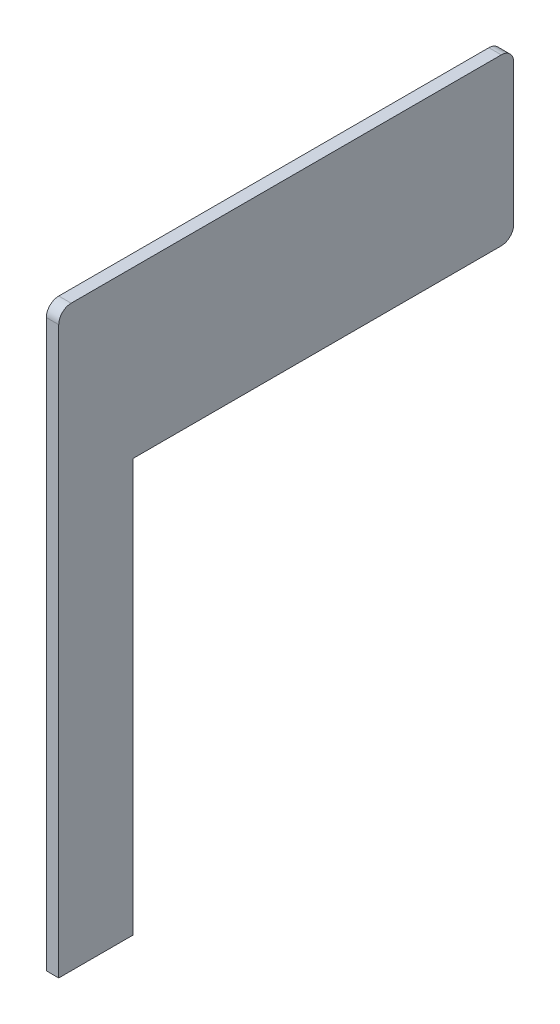
ISO-10303-21;
HEADER;
FILE_DESCRIPTION(('STEP AP214'),'2;1');
FILE_NAME('part.step','',(''),(''),'','','');
FILE_SCHEMA(('AUTOMOTIVE_DESIGN { 1 0 10303 214 1 1 1 1 }'));
ENDSEC;
DATA;
#1=APPLICATION_CONTEXT('core data for automotive mechanical design processes');
#2=APPLICATION_PROTOCOL_DEFINITION('international standard','automotive_design',2000,#1);
#3=PRODUCT_CONTEXT('',#1,'mechanical');
#4=PRODUCT('Part','Part','',(#3));
#5=PRODUCT_RELATED_PRODUCT_CATEGORY('part','',(#4));
#6=PRODUCT_DEFINITION_FORMATION('','',#4);
#7=PRODUCT_DEFINITION_CONTEXT('part definition',#1,'design');
#8=PRODUCT_DEFINITION('design','',#6,#7);
#9=PRODUCT_DEFINITION_SHAPE('','',#8);
#10=(LENGTH_UNIT() NAMED_UNIT(*) SI_UNIT(.MILLI.,.METRE.));
#11=(NAMED_UNIT(*) PLANE_ANGLE_UNIT() SI_UNIT($,.RADIAN.));
#12=(NAMED_UNIT(*) SI_UNIT($,.STERADIAN.) SOLID_ANGLE_UNIT());
#13=UNCERTAINTY_MEASURE_WITH_UNIT(LENGTH_MEASURE(1.E-05),#10,'distance_accuracy_value','');
#14=(GEOMETRIC_REPRESENTATION_CONTEXT(3) GLOBAL_UNCERTAINTY_ASSIGNED_CONTEXT((#13)) GLOBAL_UNIT_ASSIGNED_CONTEXT((#10,
#11,#12)) REPRESENTATION_CONTEXT('',''));
#15=CARTESIAN_POINT('',(0.,0.,0.));
#16=DIRECTION('',(0.,0.,1.));
#17=DIRECTION('',(1.,0.,0.));
#18=AXIS2_PLACEMENT_3D('',#15,#16,#17);
#19=CARTESIAN_POINT('',(0.3,2.,5.5));
#20=DIRECTION('',(0.,-1.,0.));
#21=DIRECTION('',(0.,0.,-1.));
#22=AXIS2_PLACEMENT_3D('',#19,#20,#21);
#23=PLANE('',#22);
#24=DIRECTION('',(0.,0.,1.));
#25=VECTOR('',#24,1.);
#26=CARTESIAN_POINT('',(0.3,2.,5.5));
#27=LINE('',#26,#25);
#28=CARTESIAN_POINT('',(0.3,2.,-5.2));
#29=VERTEX_POINT('',#28);
#30=CARTESIAN_POINT('',(0.3,2.,5.2));
#31=VERTEX_POINT('',#30);
#32=EDGE_CURVE('E149',#29,#31,#27,.T.);
#33=ORIENTED_EDGE('',*,*,#32,.F.);
#34=DIRECTION('',(-1.,0.,0.));
#35=VECTOR('',#34,1.);
#36=CARTESIAN_POINT('',(0.3,2.,-5.2));
#37=LINE('',#36,#35);
#38=CARTESIAN_POINT('',(0.,2.,-5.2));
#39=VERTEX_POINT('',#38);
#40=EDGE_CURVE('E49',#29,#39,#37,.T.);
#41=ORIENTED_EDGE('',*,*,#40,.T.);
#42=DIRECTION('',(0.,0.,1.));
#43=VECTOR('',#42,1.);
#44=CARTESIAN_POINT('',(0.,2.,5.5));
#45=LINE('',#44,#43);
#46=CARTESIAN_POINT('',(0.,2.,5.2));
#47=VERTEX_POINT('',#46);
#48=EDGE_CURVE('E145',#39,#47,#45,.T.);
#49=ORIENTED_EDGE('',*,*,#48,.T.);
#50=DIRECTION('',(-1.,0.,0.));
#51=VECTOR('',#50,1.);
#52=CARTESIAN_POINT('',(0.3,2.,5.2));
#53=LINE('',#52,#51);
#54=EDGE_CURVE('E64',#47,#31,#53,.F.);
#55=ORIENTED_EDGE('',*,*,#54,.T.);
#56=EDGE_LOOP('',(#33,#41,#49,#55));
#57=FACE_BOUND('',#56,.T.);
#58=ADVANCED_FACE('F41',(#57),#23,.F.);
#59=CARTESIAN_POINT('',(0.3,-2.,5.5));
#60=DIRECTION('',(0.,0.,-1.));
#61=DIRECTION('',(0.,1.,0.));
#62=AXIS2_PLACEMENT_3D('',#59,#60,#61);
#63=PLANE('',#62);
#64=DIRECTION('',(0.,-1.,0.));
#65=VECTOR('',#64,1.);
#66=CARTESIAN_POINT('',(0.3,1.5,5.5));
#67=LINE('',#66,#65);
#68=CARTESIAN_POINT('',(0.3,1.7,5.5));
#69=VERTEX_POINT('',#68);
#70=CARTESIAN_POINT('',(0.3,-11.98,5.5));
#71=VERTEX_POINT('',#70);
#72=EDGE_CURVE('E152',#69,#71,#67,.T.);
#73=ORIENTED_EDGE('',*,*,#72,.F.);
#74=DIRECTION('',(-1.,0.,0.));
#75=VECTOR('',#74,1.);
#76=CARTESIAN_POINT('',(0.3,1.7,5.5));
#77=LINE('',#76,#75);
#78=CARTESIAN_POINT('',(0.,1.7,5.5));
#79=VERTEX_POINT('',#78);
#80=EDGE_CURVE('E11',#69,#79,#77,.T.);
#81=ORIENTED_EDGE('',*,*,#80,.T.);
#82=DIRECTION('',(0.,-1.,0.));
#83=VECTOR('',#82,1.);
#84=CARTESIAN_POINT('',(0.,-2.,5.5));
#85=LINE('',#84,#83);
#86=CARTESIAN_POINT('',(0.,-11.98,5.5));
#87=VERTEX_POINT('',#86);
#88=EDGE_CURVE('E126',#79,#87,#85,.T.);
#89=ORIENTED_EDGE('',*,*,#88,.T.);
#90=DIRECTION('',(-1.,0.,0.));
#91=VECTOR('',#90,1.);
#92=CARTESIAN_POINT('',(0.,-11.98,5.5));
#93=LINE('',#92,#91);
#94=EDGE_CURVE('E140',#71,#87,#93,.T.);
#95=ORIENTED_EDGE('',*,*,#94,.F.);
#96=EDGE_LOOP('',(#73,#81,#89,#95));
#97=FACE_BOUND('',#96,.T.);
#98=ADVANCED_FACE('F191',(#97),#63,.F.);
#99=CARTESIAN_POINT('',(0.3,-8.98,3.7));
#100=DIRECTION('',(0.,0.,1.));
#101=DIRECTION('',(1.,0.,0.));
#102=AXIS2_PLACEMENT_3D('',#99,#100,#101);
#103=PLANE('',#102);
#104=DIRECTION('',(0.,1.,0.));
#105=VECTOR('',#104,1.);
#106=CARTESIAN_POINT('',(0.,-8.98,3.7));
#107=LINE('',#106,#105);
#108=CARTESIAN_POINT('',(0.,-11.98,3.7));
#109=VERTEX_POINT('',#108);
#110=CARTESIAN_POINT('',(0.,-2.,3.7));
#111=VERTEX_POINT('',#110);
#112=EDGE_CURVE('E114',#109,#111,#107,.T.);
#113=ORIENTED_EDGE('',*,*,#112,.T.);
#114=DIRECTION('',(-1.,0.,0.));
#115=VECTOR('',#114,1.);
#116=CARTESIAN_POINT('',(0.3,-2.,3.7));
#117=LINE('',#116,#115);
#118=CARTESIAN_POINT('',(0.3,-2.,3.7));
#119=VERTEX_POINT('',#118);
#120=EDGE_CURVE('E158',#119,#111,#117,.T.);
#121=ORIENTED_EDGE('',*,*,#120,.F.);
#122=DIRECTION('',(0.,1.,0.));
#123=VECTOR('',#122,1.);
#124=CARTESIAN_POINT('',(0.3,-8.98,3.7));
#125=LINE('',#124,#123);
#126=CARTESIAN_POINT('',(0.3,-11.98,3.7));
#127=VERTEX_POINT('',#126);
#128=EDGE_CURVE('E131',#127,#119,#125,.T.);
#129=ORIENTED_EDGE('',*,*,#128,.F.);
#130=DIRECTION('',(1.,0.,0.));
#131=VECTOR('',#130,1.);
#132=CARTESIAN_POINT('',(0.,-11.98,3.7));
#133=LINE('',#132,#131);
#134=EDGE_CURVE('E129',#109,#127,#133,.T.);
#135=ORIENTED_EDGE('',*,*,#134,.F.);
#136=EDGE_LOOP('',(#113,#121,#129,#135));
#137=FACE_BOUND('',#136,.T.);
#138=ADVANCED_FACE('F130',(#137),#103,.F.);
#139=CARTESIAN_POINT('',(0.3,-2.,3.7));
#140=DIRECTION('',(0.,1.,0.));
#141=DIRECTION('',(0.,0.,1.));
#142=AXIS2_PLACEMENT_3D('',#139,#140,#141);
#143=PLANE('',#142);
#144=DIRECTION('',(0.,0.,-1.));
#145=VECTOR('',#144,1.);
#146=CARTESIAN_POINT('',(0.,-2.,3.7));
#147=LINE('',#146,#145);
#148=CARTESIAN_POINT('',(0.,-2.,-5.2));
#149=VERTEX_POINT('',#148);
#150=EDGE_CURVE('E122',#111,#149,#147,.T.);
#151=ORIENTED_EDGE('',*,*,#150,.T.);
#152=DIRECTION('',(-1.,0.,0.));
#153=VECTOR('',#152,1.);
#154=CARTESIAN_POINT('',(0.3,-2.,-5.2));
#155=LINE('',#154,#153);
#156=CARTESIAN_POINT('',(0.3,-2.,-5.2));
#157=VERTEX_POINT('',#156);
#158=EDGE_CURVE('E176',#149,#157,#155,.F.);
#159=ORIENTED_EDGE('',*,*,#158,.T.);
#160=DIRECTION('',(0.,0.,-1.));
#161=VECTOR('',#160,1.);
#162=CARTESIAN_POINT('',(0.3,-2.,3.7));
#163=LINE('',#162,#161);
#164=EDGE_CURVE('E155',#119,#157,#163,.T.);
#165=ORIENTED_EDGE('',*,*,#164,.F.);
#166=ORIENTED_EDGE('',*,*,#120,.T.);
#167=EDGE_LOOP('',(#151,#159,#165,#166));
#168=FACE_BOUND('',#167,.T.);
#169=ADVANCED_FACE('F196',(#168),#143,.F.);
#170=CARTESIAN_POINT('',(0.3,1.5,-5.5));
#171=DIRECTION('',(0.,0.,1.));
#172=DIRECTION('',(1.,0.,0.));
#173=AXIS2_PLACEMENT_3D('',#170,#171,#172);
#174=PLANE('',#173);
#175=DIRECTION('',(0.,1.,0.));
#176=VECTOR('',#175,1.);
#177=CARTESIAN_POINT('',(0.3,1.5,-5.5));
#178=LINE('',#177,#176);
#179=CARTESIAN_POINT('',(0.3,-1.7,-5.5));
#180=VERTEX_POINT('',#179);
#181=CARTESIAN_POINT('',(0.3,1.7,-5.5));
#182=VERTEX_POINT('',#181);
#183=EDGE_CURVE('E146',#180,#182,#178,.T.);
#184=ORIENTED_EDGE('',*,*,#183,.F.);
#185=DIRECTION('',(-1.,0.,0.));
#186=VECTOR('',#185,1.);
#187=CARTESIAN_POINT('',(0.3,-1.7,-5.5));
#188=LINE('',#187,#186);
#189=CARTESIAN_POINT('',(0.,-1.7,-5.5));
#190=VERTEX_POINT('',#189);
#191=EDGE_CURVE('E167',#180,#190,#188,.T.);
#192=ORIENTED_EDGE('',*,*,#191,.T.);
#193=DIRECTION('',(0.,1.,0.));
#194=VECTOR('',#193,1.);
#195=CARTESIAN_POINT('',(0.,1.5,-5.5));
#196=LINE('',#195,#194);
#197=CARTESIAN_POINT('',(0.,1.7,-5.5));
#198=VERTEX_POINT('',#197);
#199=EDGE_CURVE('E150',#190,#198,#196,.T.);
#200=ORIENTED_EDGE('',*,*,#199,.T.);
#201=DIRECTION('',(-1.,0.,0.));
#202=VECTOR('',#201,1.);
#203=CARTESIAN_POINT('',(0.3,1.7,-5.5));
#204=LINE('',#203,#202);
#205=EDGE_CURVE('E165',#198,#182,#204,.F.);
#206=ORIENTED_EDGE('',*,*,#205,.T.);
#207=EDGE_LOOP('',(#184,#192,#200,#206));
#208=FACE_BOUND('',#207,.T.);
#209=ADVANCED_FACE('F203',(#208),#174,.F.);
#210=CARTESIAN_POINT('',(0.3,0.,0.));
#211=DIRECTION('',(-1.,0.,0.));
#212=DIRECTION('',(0.,0.,1.));
#213=AXIS2_PLACEMENT_3D('',#210,#211,#212);
#214=PLANE('',#213);
#215=ORIENTED_EDGE('',*,*,#164,.T.);
#216=CARTESIAN_POINT('',(0.3,-1.7,-5.2));
#217=DIRECTION('',(-1.,0.,0.));
#218=DIRECTION('',(0.,0.,1.));
#219=AXIS2_PLACEMENT_3D('',#216,#217,#218);
#220=CIRCLE('',#219,0.3);
#221=EDGE_CURVE('E181',#157,#180,#220,.F.);
#222=ORIENTED_EDGE('',*,*,#221,.T.);
#223=ORIENTED_EDGE('',*,*,#183,.T.);
#224=CARTESIAN_POINT('',(0.3,1.7,-5.2));
#225=DIRECTION('',(-1.,0.,0.));
#226=DIRECTION('',(0.,0.,1.));
#227=AXIS2_PLACEMENT_3D('',#224,#225,#226);
#228=CIRCLE('',#227,0.3);
#229=EDGE_CURVE('E179',#182,#29,#228,.F.);
#230=ORIENTED_EDGE('',*,*,#229,.T.);
#231=ORIENTED_EDGE('',*,*,#32,.T.);
#232=CARTESIAN_POINT('',(0.3,1.7,5.2));
#233=DIRECTION('',(-1.,0.,0.));
#234=DIRECTION('',(0.,0.,1.));
#235=AXIS2_PLACEMENT_3D('',#232,#233,#234);
#236=CIRCLE('',#235,0.3);
#237=EDGE_CURVE('E56',#31,#69,#236,.F.);
#238=ORIENTED_EDGE('',*,*,#237,.T.);
#239=ORIENTED_EDGE('',*,*,#72,.T.);
#240=DIRECTION('',(0.,0.,1.));
#241=VECTOR('',#240,1.);
#242=CARTESIAN_POINT('',(0.3,-11.98,5.5));
#243=LINE('',#242,#241);
#244=EDGE_CURVE('E135',#127,#71,#243,.T.);
#245=ORIENTED_EDGE('',*,*,#244,.F.);
#246=ORIENTED_EDGE('',*,*,#128,.T.);
#247=EDGE_LOOP('',(#215,#222,#223,#230,#231,#238,#239,#245,#246));
#248=FACE_BOUND('',#247,.T.);
#249=ADVANCED_FACE('F192',(#248),#214,.F.);
#250=CARTESIAN_POINT('',(0.,0.,0.));
#251=DIRECTION('',(-1.,0.,0.));
#252=DIRECTION('',(0.,0.,1.));
#253=AXIS2_PLACEMENT_3D('',#250,#251,#252);
#254=PLANE('',#253);
#255=ORIENTED_EDGE('',*,*,#199,.F.);
#256=CARTESIAN_POINT('',(0.,-1.7,-5.2));
#257=DIRECTION('',(-1.,0.,0.));
#258=DIRECTION('',(0.,0.,1.));
#259=AXIS2_PLACEMENT_3D('',#256,#257,#258);
#260=CIRCLE('',#259,0.3);
#261=EDGE_CURVE('E174',#190,#149,#260,.T.);
#262=ORIENTED_EDGE('',*,*,#261,.T.);
#263=ORIENTED_EDGE('',*,*,#150,.F.);
#264=ORIENTED_EDGE('',*,*,#112,.F.);
#265=DIRECTION('',(0.,0.,-1.));
#266=VECTOR('',#265,1.);
#267=CARTESIAN_POINT('',(0.,-11.98,5.5));
#268=LINE('',#267,#266);
#269=EDGE_CURVE('E120',#87,#109,#268,.T.);
#270=ORIENTED_EDGE('',*,*,#269,.F.);
#271=ORIENTED_EDGE('',*,*,#88,.F.);
#272=CARTESIAN_POINT('',(0.,1.7,5.2));
#273=DIRECTION('',(-1.,0.,0.));
#274=DIRECTION('',(0.,0.,1.));
#275=AXIS2_PLACEMENT_3D('',#272,#273,#274);
#276=CIRCLE('',#275,0.3);
#277=EDGE_CURVE('E170',#79,#47,#276,.T.);
#278=ORIENTED_EDGE('',*,*,#277,.T.);
#279=ORIENTED_EDGE('',*,*,#48,.F.);
#280=CARTESIAN_POINT('',(0.,1.7,-5.2));
#281=DIRECTION('',(-1.,0.,0.));
#282=DIRECTION('',(0.,0.,1.));
#283=AXIS2_PLACEMENT_3D('',#280,#281,#282);
#284=CIRCLE('',#283,0.3);
#285=EDGE_CURVE('E172',#39,#198,#284,.T.);
#286=ORIENTED_EDGE('',*,*,#285,.T.);
#287=EDGE_LOOP('',(#255,#262,#263,#264,#270,#271,#278,#279,#286));
#288=FACE_BOUND('',#287,.T.);
#289=ADVANCED_FACE('F117',(#288),#254,.T.);
#290=CARTESIAN_POINT('',(0.3,-1.7,-5.2));
#291=DIRECTION('',(-1.,0.,0.));
#292=DIRECTION('',(0.,0.,1.));
#293=AXIS2_PLACEMENT_3D('',#290,#291,#292);
#294=CYLINDRICAL_SURFACE('',#293,0.3);
#295=ORIENTED_EDGE('',*,*,#221,.F.);
#296=ORIENTED_EDGE('',*,*,#158,.F.);
#297=ORIENTED_EDGE('',*,*,#261,.F.);
#298=ORIENTED_EDGE('',*,*,#191,.F.);
#299=EDGE_LOOP('',(#295,#296,#297,#298));
#300=FACE_BOUND('',#299,.T.);
#301=ADVANCED_FACE('F199',(#300),#294,.T.);
#302=CARTESIAN_POINT('',(0.3,1.7,-5.2));
#303=DIRECTION('',(-1.,0.,0.));
#304=DIRECTION('',(0.,0.,1.));
#305=AXIS2_PLACEMENT_3D('',#302,#303,#304);
#306=CYLINDRICAL_SURFACE('',#305,0.3);
#307=ORIENTED_EDGE('',*,*,#229,.F.);
#308=ORIENTED_EDGE('',*,*,#205,.F.);
#309=ORIENTED_EDGE('',*,*,#285,.F.);
#310=ORIENTED_EDGE('',*,*,#40,.F.);
#311=EDGE_LOOP('',(#307,#308,#309,#310));
#312=FACE_BOUND('',#311,.T.);
#313=ADVANCED_FACE('F205',(#312),#306,.T.);
#314=CARTESIAN_POINT('',(0.3,1.7,5.2));
#315=DIRECTION('',(-1.,0.,0.));
#316=DIRECTION('',(0.,0.,1.));
#317=AXIS2_PLACEMENT_3D('',#314,#315,#316);
#318=CYLINDRICAL_SURFACE('',#317,0.3);
#319=ORIENTED_EDGE('',*,*,#237,.F.);
#320=ORIENTED_EDGE('',*,*,#54,.F.);
#321=ORIENTED_EDGE('',*,*,#277,.F.);
#322=ORIENTED_EDGE('',*,*,#80,.F.);
#323=EDGE_LOOP('',(#319,#320,#321,#322));
#324=FACE_BOUND('',#323,.T.);
#325=ADVANCED_FACE('F43',(#324),#318,.T.);
#326=CARTESIAN_POINT('',(0.,-11.98,0.));
#327=DIRECTION('',(0.,-1.,0.));
#328=DIRECTION('',(0.,0.,-1.));
#329=AXIS2_PLACEMENT_3D('',#326,#327,#328);
#330=PLANE('',#329);
#331=ORIENTED_EDGE('',*,*,#269,.T.);
#332=ORIENTED_EDGE('',*,*,#134,.T.);
#333=ORIENTED_EDGE('',*,*,#244,.T.);
#334=ORIENTED_EDGE('',*,*,#94,.T.);
#335=EDGE_LOOP('',(#331,#332,#333,#334));
#336=FACE_BOUND('',#335,.T.);
#337=ADVANCED_FACE('F138',(#336),#330,.T.);
#338=CLOSED_SHELL('',(#58,#98,#138,#169,#209,#249,#289,#301,#313,#325,#337));
#339=MANIFOLD_SOLID_BREP('B2',#338);
#340=ADVANCED_BREP_SHAPE_REPRESENTATION('',(#18,#339),#14);
#341=SHAPE_DEFINITION_REPRESENTATION(#9,#340);
ENDSEC;
END-ISO-10303-21;
